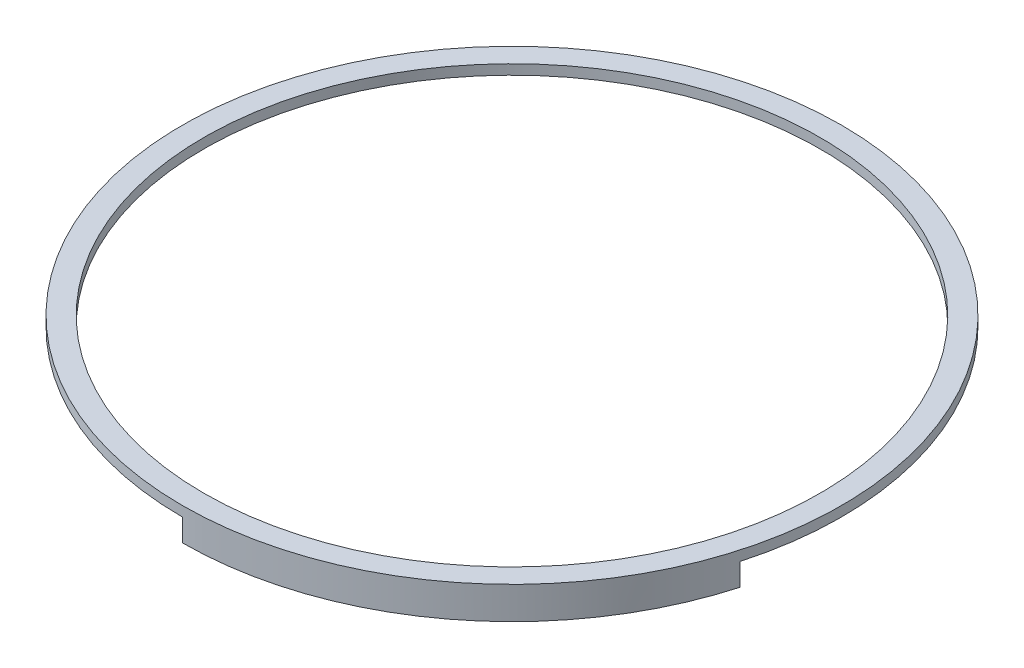
ISO-10303-21;
HEADER;
FILE_DESCRIPTION(('STEP AP214'),'2;1');
FILE_NAME('part.step','',(''),(''),'','','');
FILE_SCHEMA(('AUTOMOTIVE_DESIGN { 1 0 10303 214 1 1 1 1 }'));
ENDSEC;
DATA;
#1=APPLICATION_CONTEXT('core data for automotive mechanical design processes');
#2=APPLICATION_PROTOCOL_DEFINITION('international standard','automotive_design',2000,#1);
#3=PRODUCT_CONTEXT('',#1,'mechanical');
#4=PRODUCT('Part','Part','',(#3));
#5=PRODUCT_RELATED_PRODUCT_CATEGORY('part','',(#4));
#6=PRODUCT_DEFINITION_FORMATION('','',#4);
#7=PRODUCT_DEFINITION_CONTEXT('part definition',#1,'design');
#8=PRODUCT_DEFINITION('design','',#6,#7);
#9=PRODUCT_DEFINITION_SHAPE('','',#8);
#10=(LENGTH_UNIT() NAMED_UNIT(*) SI_UNIT(.MILLI.,.METRE.));
#11=(NAMED_UNIT(*) PLANE_ANGLE_UNIT() SI_UNIT($,.RADIAN.));
#12=(NAMED_UNIT(*) SI_UNIT($,.STERADIAN.) SOLID_ANGLE_UNIT());
#13=UNCERTAINTY_MEASURE_WITH_UNIT(LENGTH_MEASURE(1.E-05),#10,'distance_accuracy_value','');
#14=(GEOMETRIC_REPRESENTATION_CONTEXT(3) GLOBAL_UNCERTAINTY_ASSIGNED_CONTEXT((#13)) GLOBAL_UNIT_ASSIGNED_CONTEXT((#10,
#11,#12)) REPRESENTATION_CONTEXT('',''));
#15=CARTESIAN_POINT('',(0.,0.,0.));
#16=DIRECTION('',(0.,0.,1.));
#17=DIRECTION('',(1.,0.,0.));
#18=AXIS2_PLACEMENT_3D('',#15,#16,#17);
#19=CARTESIAN_POINT('',(0.,2.,0.));
#20=DIRECTION('',(0.,1.,0.));
#21=DIRECTION('',(0.,0.,1.));
#22=AXIS2_PLACEMENT_3D('',#19,#20,#21);
#23=PLANE('',#22);
#24=CARTESIAN_POINT('',(0.,2.,0.));
#25=DIRECTION('',(0.,1.,0.));
#26=DIRECTION('',(0.,0.,1.));
#27=AXIS2_PLACEMENT_3D('',#24,#25,#26);
#28=CIRCLE('',#27,66.3);
#29=CARTESIAN_POINT('',(0.,2.,66.3));
#30=VERTEX_POINT('',#29);
#31=EDGE_CURVE('E11',#30,#30,#28,.T.);
#32=ORIENTED_EDGE('',*,*,#31,.T.);
#33=EDGE_LOOP('',(#32));
#34=FACE_BOUND('',#33,.T.);
#35=CARTESIAN_POINT('',(0.,2.,0.));
#36=DIRECTION('',(0.,1.,0.));
#37=DIRECTION('',(0.,0.,1.));
#38=AXIS2_PLACEMENT_3D('',#35,#36,#37);
#39=CIRCLE('',#38,62.);
#40=CARTESIAN_POINT('',(0.,2.,62.));
#41=VERTEX_POINT('',#40);
#42=EDGE_CURVE('E112',#41,#41,#39,.T.);
#43=ORIENTED_EDGE('',*,*,#42,.F.);
#44=EDGE_LOOP('',(#43));
#45=FACE_BOUND('',#44,.T.);
#46=ADVANCED_FACE('F35',(#34,#45),#23,.T.);
#47=CARTESIAN_POINT('',(0.,0.,0.));
#48=DIRECTION('',(0.,1.,0.));
#49=DIRECTION('',(0.,0.,1.));
#50=AXIS2_PLACEMENT_3D('',#47,#48,#49);
#51=PLANE('',#50);
#52=CARTESIAN_POINT('',(0.,0.,0.));
#53=DIRECTION('',(0.,-1.,0.));
#54=DIRECTION('',(0.,0.,-1.));
#55=AXIS2_PLACEMENT_3D('',#52,#53,#54);
#56=CIRCLE('',#55,65.3);
#57=CARTESIAN_POINT('',(62.8700330173753,0.,17.6479162621015));
#58=VERTEX_POINT('',#57);
#59=CARTESIAN_POINT('',(0.,0.,65.3));
#60=VERTEX_POINT('',#59);
#61=EDGE_CURVE('E50',#58,#60,#56,.T.);
#62=ORIENTED_EDGE('',*,*,#61,.T.);
#63=DIRECTION('',(0.,0.,1.));
#64=VECTOR('',#63,1.);
#65=CARTESIAN_POINT('',(0.,0.,0.));
#66=LINE('',#65,#64);
#67=CARTESIAN_POINT('',(0.,0.,66.3));
#68=VERTEX_POINT('',#67);
#69=EDGE_CURVE('E100',#60,#68,#66,.T.);
#70=ORIENTED_EDGE('',*,*,#69,.T.);
#71=CARTESIAN_POINT('',(0.,0.,0.));
#72=DIRECTION('',(0.,1.,0.));
#73=DIRECTION('',(0.,0.,1.));
#74=AXIS2_PLACEMENT_3D('',#71,#72,#73);
#75=CIRCLE('',#74,66.3);
#76=CARTESIAN_POINT('',(63.8328206592953,0.,17.9181753166513));
#77=VERTEX_POINT('',#76);
#78=EDGE_CURVE('E39',#77,#68,#75,.T.);
#79=ORIENTED_EDGE('',*,*,#78,.F.);
#80=DIRECTION('',(-0.962787641919989,0.,-0.270259054549792));
#81=VECTOR('',#80,1.);
#82=CARTESIAN_POINT('',(0.,0.,0.));
#83=LINE('',#82,#81);
#84=EDGE_CURVE('E85',#77,#58,#83,.T.);
#85=ORIENTED_EDGE('',*,*,#84,.T.);
#86=EDGE_LOOP('',(#62,#70,#79,#85));
#87=FACE_BOUND('',#86,.T.);
#88=CARTESIAN_POINT('',(0.,0.,0.));
#89=DIRECTION('',(0.,1.,0.));
#90=DIRECTION('',(0.,0.,1.));
#91=AXIS2_PLACEMENT_3D('',#88,#89,#90);
#92=CIRCLE('',#91,62.);
#93=CARTESIAN_POINT('',(0.,0.,62.));
#94=VERTEX_POINT('',#93);
#95=EDGE_CURVE('E111',#94,#94,#92,.T.);
#96=ORIENTED_EDGE('',*,*,#95,.T.);
#97=EDGE_LOOP('',(#96));
#98=FACE_BOUND('',#97,.T.);
#99=ADVANCED_FACE('F118',(#87,#98),#51,.F.);
#100=CARTESIAN_POINT('',(0.,2.,0.));
#101=DIRECTION('',(0.,-1.,0.));
#102=DIRECTION('',(0.,0.,-1.));
#103=AXIS2_PLACEMENT_3D('',#100,#101,#102);
#104=CYLINDRICAL_SURFACE('',#103,66.3);
#105=ORIENTED_EDGE('',*,*,#31,.F.);
#106=EDGE_LOOP('',(#105));
#107=FACE_BOUND('',#106,.T.);
#108=ORIENTED_EDGE('',*,*,#78,.T.);
#109=DIRECTION('',(0.,1.,0.));
#110=VECTOR('',#109,1.);
#111=CARTESIAN_POINT('',(0.,-4.5,66.3));
#112=LINE('',#111,#110);
#113=CARTESIAN_POINT('',(0.,-4.5,66.3));
#114=VERTEX_POINT('',#113);
#115=EDGE_CURVE('E89',#114,#68,#112,.T.);
#116=ORIENTED_EDGE('',*,*,#115,.F.);
#117=CARTESIAN_POINT('',(0.,-4.5,0.));
#118=DIRECTION('',(0.,-1.,0.));
#119=DIRECTION('',(0.,0.,-1.));
#120=AXIS2_PLACEMENT_3D('',#117,#118,#119);
#121=CIRCLE('',#120,66.3);
#122=CARTESIAN_POINT('',(63.8328206592953,-4.5,17.9181753166513));
#123=VERTEX_POINT('',#122);
#124=EDGE_CURVE('E92',#123,#114,#121,.T.);
#125=ORIENTED_EDGE('',*,*,#124,.F.);
#126=DIRECTION('',(0.,1.,0.));
#127=VECTOR('',#126,1.);
#128=CARTESIAN_POINT('',(63.8328206592953,-4.5,17.9181753166513));
#129=LINE('',#128,#127);
#130=EDGE_CURVE('E79',#123,#77,#129,.T.);
#131=ORIENTED_EDGE('',*,*,#130,.T.);
#132=EDGE_LOOP('',(#108,#116,#125,#131));
#133=FACE_BOUND('',#132,.T.);
#134=ADVANCED_FACE('F37',(#107,#133),#104,.T.);
#135=CARTESIAN_POINT('',(0.,2.,0.));
#136=DIRECTION('',(0.,-1.,0.));
#137=DIRECTION('',(0.,0.,-1.));
#138=AXIS2_PLACEMENT_3D('',#135,#136,#137);
#139=CYLINDRICAL_SURFACE('',#138,62.);
#140=ORIENTED_EDGE('',*,*,#42,.T.);
#141=EDGE_LOOP('',(#140));
#142=FACE_BOUND('',#141,.T.);
#143=ORIENTED_EDGE('',*,*,#95,.F.);
#144=EDGE_LOOP('',(#143));
#145=FACE_BOUND('',#144,.T.);
#146=ADVANCED_FACE('F120',(#142,#145),#139,.F.);
#147=CARTESIAN_POINT('',(0.,-4.5,0.));
#148=DIRECTION('',(0.,1.,0.));
#149=DIRECTION('',(0.,0.,1.));
#150=AXIS2_PLACEMENT_3D('',#147,#148,#149);
#151=CYLINDRICAL_SURFACE('',#150,65.3);
#152=ORIENTED_EDGE('',*,*,#61,.F.);
#153=DIRECTION('',(0.,1.,0.));
#154=VECTOR('',#153,1.);
#155=CARTESIAN_POINT('',(62.8700330173753,-4.5,17.6479162621015));
#156=LINE('',#155,#154);
#157=CARTESIAN_POINT('',(62.8700330173753,-4.5,17.6479162621015));
#158=VERTEX_POINT('',#157);
#159=EDGE_CURVE('E73',#158,#58,#156,.T.);
#160=ORIENTED_EDGE('',*,*,#159,.F.);
#161=CARTESIAN_POINT('',(0.,-4.5,0.));
#162=DIRECTION('',(0.,-1.,0.));
#163=DIRECTION('',(0.,0.,-1.));
#164=AXIS2_PLACEMENT_3D('',#161,#162,#163);
#165=CIRCLE('',#164,65.3);
#166=CARTESIAN_POINT('',(0.,-4.5,65.3));
#167=VERTEX_POINT('',#166);
#168=EDGE_CURVE('E98',#158,#167,#165,.T.);
#169=ORIENTED_EDGE('',*,*,#168,.T.);
#170=DIRECTION('',(0.,1.,0.));
#171=VECTOR('',#170,1.);
#172=CARTESIAN_POINT('',(0.,-4.5,65.3));
#173=LINE('',#172,#171);
#174=EDGE_CURVE('E58',#167,#60,#173,.T.);
#175=ORIENTED_EDGE('',*,*,#174,.T.);
#176=EDGE_LOOP('',(#152,#160,#169,#175));
#177=FACE_BOUND('',#176,.T.);
#178=ADVANCED_FACE('F122',(#177),#151,.F.);
#179=CARTESIAN_POINT('',(0.,-4.5,0.));
#180=DIRECTION('',(0.270259054549792,0.,-0.962787641919989));
#181=DIRECTION('',(-0.962787641919989,0.,-0.270259054549792));
#182=AXIS2_PLACEMENT_3D('',#179,#180,#181);
#183=PLANE('',#182);
#184=ORIENTED_EDGE('',*,*,#84,.F.);
#185=ORIENTED_EDGE('',*,*,#130,.F.);
#186=DIRECTION('',(-0.962787641919989,0.,-0.270259054549792));
#187=VECTOR('',#186,1.);
#188=CARTESIAN_POINT('',(0.,-4.5,0.));
#189=LINE('',#188,#187);
#190=EDGE_CURVE('E83',#123,#158,#189,.T.);
#191=ORIENTED_EDGE('',*,*,#190,.T.);
#192=ORIENTED_EDGE('',*,*,#159,.T.);
#193=EDGE_LOOP('',(#184,#185,#191,#192));
#194=FACE_BOUND('',#193,.T.);
#195=ADVANCED_FACE('F81',(#194),#183,.T.);
#196=CARTESIAN_POINT('',(0.,-4.5,0.));
#197=DIRECTION('',(-1.,0.,0.));
#198=DIRECTION('',(0.,0.,1.));
#199=AXIS2_PLACEMENT_3D('',#196,#197,#198);
#200=PLANE('',#199);
#201=ORIENTED_EDGE('',*,*,#69,.F.);
#202=ORIENTED_EDGE('',*,*,#174,.F.);
#203=DIRECTION('',(0.,0.,1.));
#204=VECTOR('',#203,1.);
#205=CARTESIAN_POINT('',(0.,-4.5,0.));
#206=LINE('',#205,#204);
#207=EDGE_CURVE('E95',#167,#114,#206,.T.);
#208=ORIENTED_EDGE('',*,*,#207,.T.);
#209=ORIENTED_EDGE('',*,*,#115,.T.);
#210=EDGE_LOOP('',(#201,#202,#208,#209));
#211=FACE_BOUND('',#210,.T.);
#212=ADVANCED_FACE('F143',(#211),#200,.T.);
#213=CARTESIAN_POINT('',(0.,-4.5,0.));
#214=DIRECTION('',(0.,-1.,0.));
#215=DIRECTION('',(0.,0.,-1.));
#216=AXIS2_PLACEMENT_3D('',#213,#214,#215);
#217=PLANE('',#216);
#218=ORIENTED_EDGE('',*,*,#168,.F.);
#219=ORIENTED_EDGE('',*,*,#190,.F.);
#220=ORIENTED_EDGE('',*,*,#124,.T.);
#221=ORIENTED_EDGE('',*,*,#207,.F.);
#222=EDGE_LOOP('',(#218,#219,#220,#221));
#223=FACE_BOUND('',#222,.T.);
#224=ADVANCED_FACE('F97',(#223),#217,.T.);
#225=CLOSED_SHELL('',(#46,#99,#134,#146,#178,#195,#212,#224));
#226=MANIFOLD_SOLID_BREP('B2',#225);
#227=ADVANCED_BREP_SHAPE_REPRESENTATION('',(#18,#226),#14);
#228=SHAPE_DEFINITION_REPRESENTATION(#9,#227);
ENDSEC;
END-ISO-10303-21;
